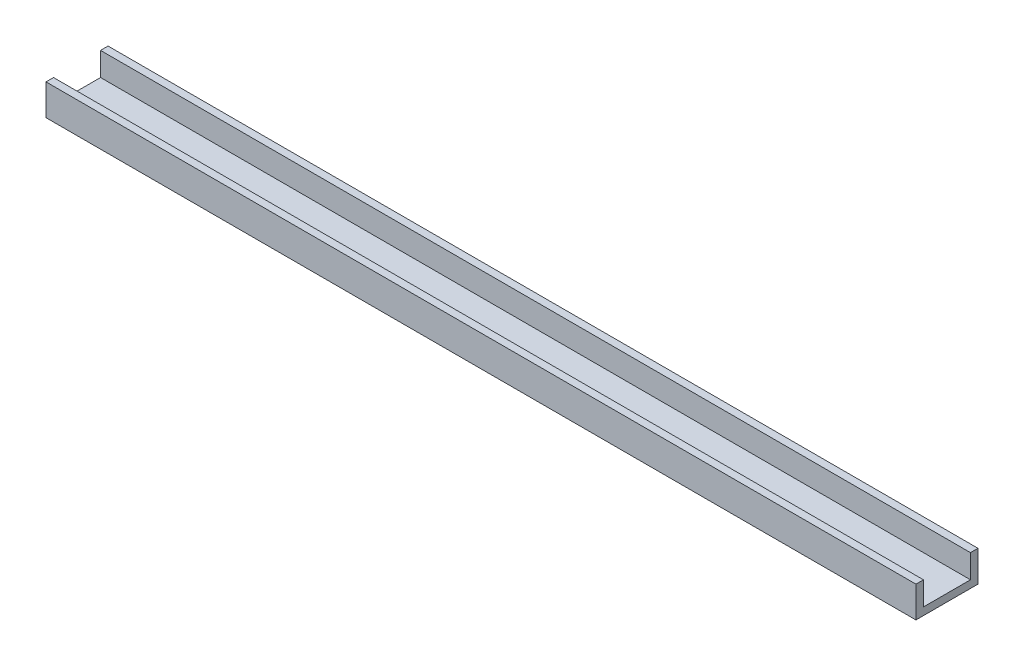
ISO-10303-21;
HEADER;
FILE_DESCRIPTION(('STEP AP214'),'2;1');
FILE_NAME('part.step','',(''),(''),'','','');
FILE_SCHEMA(('AUTOMOTIVE_DESIGN { 1 0 10303 214 1 1 1 1 }'));
ENDSEC;
DATA;
#1=APPLICATION_CONTEXT('core data for automotive mechanical design processes');
#2=APPLICATION_PROTOCOL_DEFINITION('international standard','automotive_design',2000,#1);
#3=PRODUCT_CONTEXT('',#1,'mechanical');
#4=PRODUCT('Part','Part','',(#3));
#5=PRODUCT_RELATED_PRODUCT_CATEGORY('part','',(#4));
#6=PRODUCT_DEFINITION_FORMATION('','',#4);
#7=PRODUCT_DEFINITION_CONTEXT('part definition',#1,'design');
#8=PRODUCT_DEFINITION('design','',#6,#7);
#9=PRODUCT_DEFINITION_SHAPE('','',#8);
#10=(LENGTH_UNIT() NAMED_UNIT(*) SI_UNIT(.MILLI.,.METRE.));
#11=(NAMED_UNIT(*) PLANE_ANGLE_UNIT() SI_UNIT($,.RADIAN.));
#12=(NAMED_UNIT(*) SI_UNIT($,.STERADIAN.) SOLID_ANGLE_UNIT());
#13=UNCERTAINTY_MEASURE_WITH_UNIT(LENGTH_MEASURE(1.E-05),#10,'distance_accuracy_value','');
#14=(GEOMETRIC_REPRESENTATION_CONTEXT(3) GLOBAL_UNCERTAINTY_ASSIGNED_CONTEXT((#13)) GLOBAL_UNIT_ASSIGNED_CONTEXT((#10,
#11,#12)) REPRESENTATION_CONTEXT('',''));
#15=CARTESIAN_POINT('',(0.,0.,0.));
#16=DIRECTION('',(0.,0.,1.));
#17=DIRECTION('',(1.,0.,0.));
#18=AXIS2_PLACEMENT_3D('',#15,#16,#17);
#19=CARTESIAN_POINT('',(1850.,50.,0.));
#20=DIRECTION('',(0.,-1.,0.));
#21=DIRECTION('',(0.,0.,-1.));
#22=AXIS2_PLACEMENT_3D('',#19,#20,#21);
#23=PLANE('',#22);
#24=DIRECTION('',(0.,0.,1.));
#25=VECTOR('',#24,1.);
#26=CARTESIAN_POINT('',(0.,50.,0.));
#27=LINE('',#26,#25);
#28=CARTESIAN_POINT('',(0.,50.,0.));
#29=VERTEX_POINT('',#28);
#30=CARTESIAN_POINT('',(0.,50.,16.));
#31=VERTEX_POINT('',#30);
#32=EDGE_CURVE('E129',#29,#31,#27,.T.);
#33=ORIENTED_EDGE('',*,*,#32,.T.);
#34=DIRECTION('',(-1.,0.,0.));
#35=VECTOR('',#34,1.);
#36=CARTESIAN_POINT('',(1850.,50.,16.));
#37=LINE('',#36,#35);
#38=CARTESIAN_POINT('',(1850.,50.,16.));
#39=VERTEX_POINT('',#38);
#40=EDGE_CURVE('E11',#39,#31,#37,.T.);
#41=ORIENTED_EDGE('',*,*,#40,.F.);
#42=DIRECTION('',(0.,0.,1.));
#43=VECTOR('',#42,1.);
#44=CARTESIAN_POINT('',(1850.,50.,0.));
#45=LINE('',#44,#43);
#46=CARTESIAN_POINT('',(1850.,50.,0.));
#47=VERTEX_POINT('',#46);
#48=EDGE_CURVE('E143',#47,#39,#45,.T.);
#49=ORIENTED_EDGE('',*,*,#48,.F.);
#50=DIRECTION('',(-1.,0.,0.));
#51=VECTOR('',#50,1.);
#52=CARTESIAN_POINT('',(1850.,50.,0.));
#53=LINE('',#52,#51);
#54=EDGE_CURVE('E125',#47,#29,#53,.T.);
#55=ORIENTED_EDGE('',*,*,#54,.T.);
#56=EDGE_LOOP('',(#33,#41,#49,#55));
#57=FACE_BOUND('',#56,.T.);
#58=ADVANCED_FACE('F33',(#57),#23,.F.);
#59=CARTESIAN_POINT('',(1850.,50.,16.));
#60=DIRECTION('',(0.,0.,-1.));
#61=DIRECTION('',(-1.,0.,0.));
#62=AXIS2_PLACEMENT_3D('',#59,#60,#61);
#63=PLANE('',#62);
#64=DIRECTION('',(0.,-1.,0.));
#65=VECTOR('',#64,1.);
#66=CARTESIAN_POINT('',(0.,50.,16.));
#67=LINE('',#66,#65);
#68=CARTESIAN_POINT('',(0.,-16.,16.));
#69=VERTEX_POINT('',#68);
#70=EDGE_CURVE('E132',#31,#69,#67,.T.);
#71=ORIENTED_EDGE('',*,*,#70,.T.);
#72=DIRECTION('',(-1.,0.,0.));
#73=VECTOR('',#72,1.);
#74=CARTESIAN_POINT('',(1850.,-16.,16.));
#75=LINE('',#74,#73);
#76=CARTESIAN_POINT('',(1850.,-16.,16.));
#77=VERTEX_POINT('',#76);
#78=EDGE_CURVE('E41',#77,#69,#75,.T.);
#79=ORIENTED_EDGE('',*,*,#78,.F.);
#80=DIRECTION('',(0.,-1.,0.));
#81=VECTOR('',#80,1.);
#82=CARTESIAN_POINT('',(1850.,50.,16.));
#83=LINE('',#82,#81);
#84=EDGE_CURVE('E92',#39,#77,#83,.T.);
#85=ORIENTED_EDGE('',*,*,#84,.F.);
#86=ORIENTED_EDGE('',*,*,#40,.T.);
#87=EDGE_LOOP('',(#71,#79,#85,#86));
#88=FACE_BOUND('',#87,.T.);
#89=ADVANCED_FACE('F178',(#88),#63,.F.);
#90=CARTESIAN_POINT('',(1850.,-16.,16.));
#91=DIRECTION('',(0.,1.,0.));
#92=DIRECTION('',(0.,0.,1.));
#93=AXIS2_PLACEMENT_3D('',#90,#91,#92);
#94=PLANE('',#93);
#95=DIRECTION('',(0.,0.,-1.));
#96=VECTOR('',#95,1.);
#97=CARTESIAN_POINT('',(0.,-16.,16.));
#98=LINE('',#97,#96);
#99=CARTESIAN_POINT('',(0.,-16.,-116.));
#100=VERTEX_POINT('',#99);
#101=EDGE_CURVE('E134',#69,#100,#98,.T.);
#102=ORIENTED_EDGE('',*,*,#101,.T.);
#103=DIRECTION('',(-1.,0.,0.));
#104=VECTOR('',#103,1.);
#105=CARTESIAN_POINT('',(1850.,-16.,-116.));
#106=LINE('',#105,#104);
#107=CARTESIAN_POINT('',(1850.,-16.,-116.));
#108=VERTEX_POINT('',#107);
#109=EDGE_CURVE('E150',#108,#100,#106,.T.);
#110=ORIENTED_EDGE('',*,*,#109,.F.);
#111=DIRECTION('',(0.,0.,-1.));
#112=VECTOR('',#111,1.);
#113=CARTESIAN_POINT('',(1850.,-16.,16.));
#114=LINE('',#113,#112);
#115=EDGE_CURVE('E158',#77,#108,#114,.T.);
#116=ORIENTED_EDGE('',*,*,#115,.F.);
#117=ORIENTED_EDGE('',*,*,#78,.T.);
#118=EDGE_LOOP('',(#102,#110,#116,#117));
#119=FACE_BOUND('',#118,.T.);
#120=ADVANCED_FACE('F156',(#119),#94,.F.);
#121=CARTESIAN_POINT('',(1850.,-16.,-116.));
#122=DIRECTION('',(0.,0.,1.));
#123=DIRECTION('',(1.,0.,0.));
#124=AXIS2_PLACEMENT_3D('',#121,#122,#123);
#125=PLANE('',#124);
#126=DIRECTION('',(0.,1.,0.));
#127=VECTOR('',#126,1.);
#128=CARTESIAN_POINT('',(0.,-16.,-116.));
#129=LINE('',#128,#127);
#130=CARTESIAN_POINT('',(0.,50.,-116.));
#131=VERTEX_POINT('',#130);
#132=EDGE_CURVE('E136',#100,#131,#129,.T.);
#133=ORIENTED_EDGE('',*,*,#132,.T.);
#134=DIRECTION('',(-1.,0.,0.));
#135=VECTOR('',#134,1.);
#136=CARTESIAN_POINT('',(1850.,50.,-116.));
#137=LINE('',#136,#135);
#138=CARTESIAN_POINT('',(1850.,50.,-116.));
#139=VERTEX_POINT('',#138);
#140=EDGE_CURVE('E147',#139,#131,#137,.T.);
#141=ORIENTED_EDGE('',*,*,#140,.F.);
#142=DIRECTION('',(0.,1.,0.));
#143=VECTOR('',#142,1.);
#144=CARTESIAN_POINT('',(1850.,-16.,-116.));
#145=LINE('',#144,#143);
#146=EDGE_CURVE('E170',#108,#139,#145,.T.);
#147=ORIENTED_EDGE('',*,*,#146,.F.);
#148=ORIENTED_EDGE('',*,*,#109,.T.);
#149=EDGE_LOOP('',(#133,#141,#147,#148));
#150=FACE_BOUND('',#149,.T.);
#151=ADVANCED_FACE('F166',(#150),#125,.F.);
#152=CARTESIAN_POINT('',(1850.,50.,-100.));
#153=DIRECTION('',(0.,-1.,0.));
#154=DIRECTION('',(0.,0.,-1.));
#155=AXIS2_PLACEMENT_3D('',#152,#153,#154);
#156=PLANE('',#155);
#157=DIRECTION('',(0.,0.,1.));
#158=VECTOR('',#157,1.);
#159=CARTESIAN_POINT('',(0.,50.,-100.));
#160=LINE('',#159,#158);
#161=CARTESIAN_POINT('',(0.,50.,-100.));
#162=VERTEX_POINT('',#161);
#163=EDGE_CURVE('E138',#131,#162,#160,.T.);
#164=ORIENTED_EDGE('',*,*,#163,.T.);
#165=DIRECTION('',(-1.,0.,0.));
#166=VECTOR('',#165,1.);
#167=CARTESIAN_POINT('',(1850.,50.,-100.));
#168=LINE('',#167,#166);
#169=CARTESIAN_POINT('',(1850.,50.,-100.));
#170=VERTEX_POINT('',#169);
#171=EDGE_CURVE('E120',#170,#162,#168,.T.);
#172=ORIENTED_EDGE('',*,*,#171,.F.);
#173=DIRECTION('',(0.,0.,1.));
#174=VECTOR('',#173,1.);
#175=CARTESIAN_POINT('',(1850.,50.,-100.));
#176=LINE('',#175,#174);
#177=EDGE_CURVE('E111',#139,#170,#176,.T.);
#178=ORIENTED_EDGE('',*,*,#177,.F.);
#179=ORIENTED_EDGE('',*,*,#140,.T.);
#180=EDGE_LOOP('',(#164,#172,#178,#179));
#181=FACE_BOUND('',#180,.T.);
#182=ADVANCED_FACE('F169',(#181),#156,.F.);
#183=CARTESIAN_POINT('',(1850.,0.,-100.));
#184=DIRECTION('',(0.,0.,-1.));
#185=DIRECTION('',(-1.,0.,0.));
#186=AXIS2_PLACEMENT_3D('',#183,#184,#185);
#187=PLANE('',#186);
#188=DIRECTION('',(0.,-1.,0.));
#189=VECTOR('',#188,1.);
#190=CARTESIAN_POINT('',(0.,0.,-100.));
#191=LINE('',#190,#189);
#192=CARTESIAN_POINT('',(0.,0.,-100.));
#193=VERTEX_POINT('',#192);
#194=EDGE_CURVE('E119',#162,#193,#191,.T.);
#195=ORIENTED_EDGE('',*,*,#194,.T.);
#196=DIRECTION('',(-1.,0.,0.));
#197=VECTOR('',#196,1.);
#198=CARTESIAN_POINT('',(1850.,0.,-100.));
#199=LINE('',#198,#197);
#200=CARTESIAN_POINT('',(1850.,0.,-100.));
#201=VERTEX_POINT('',#200);
#202=EDGE_CURVE('E116',#201,#193,#199,.T.);
#203=ORIENTED_EDGE('',*,*,#202,.F.);
#204=DIRECTION('',(0.,-1.,0.));
#205=VECTOR('',#204,1.);
#206=CARTESIAN_POINT('',(1850.,0.,-100.));
#207=LINE('',#206,#205);
#208=EDGE_CURVE('E105',#170,#201,#207,.T.);
#209=ORIENTED_EDGE('',*,*,#208,.F.);
#210=ORIENTED_EDGE('',*,*,#171,.T.);
#211=EDGE_LOOP('',(#195,#203,#209,#210));
#212=FACE_BOUND('',#211,.T.);
#213=ADVANCED_FACE('F117',(#212),#187,.F.);
#214=CARTESIAN_POINT('',(1850.,0.,0.));
#215=DIRECTION('',(0.,-1.,0.));
#216=DIRECTION('',(0.,0.,-1.));
#217=AXIS2_PLACEMENT_3D('',#214,#215,#216);
#218=PLANE('',#217);
#219=DIRECTION('',(0.,0.,1.));
#220=VECTOR('',#219,1.);
#221=CARTESIAN_POINT('',(0.,0.,0.));
#222=LINE('',#221,#220);
#223=CARTESIAN_POINT('',(0.,0.,0.));
#224=VERTEX_POINT('',#223);
#225=EDGE_CURVE('E78',#193,#224,#222,.T.);
#226=ORIENTED_EDGE('',*,*,#225,.T.);
#227=DIRECTION('',(-1.,0.,0.));
#228=VECTOR('',#227,1.);
#229=CARTESIAN_POINT('',(1850.,0.,0.));
#230=LINE('',#229,#228);
#231=CARTESIAN_POINT('',(1850.,0.,0.));
#232=VERTEX_POINT('',#231);
#233=EDGE_CURVE('E121',#232,#224,#230,.T.);
#234=ORIENTED_EDGE('',*,*,#233,.F.);
#235=DIRECTION('',(0.,0.,1.));
#236=VECTOR('',#235,1.);
#237=CARTESIAN_POINT('',(1850.,0.,0.));
#238=LINE('',#237,#236);
#239=EDGE_CURVE('E109',#201,#232,#238,.T.);
#240=ORIENTED_EDGE('',*,*,#239,.F.);
#241=ORIENTED_EDGE('',*,*,#202,.T.);
#242=EDGE_LOOP('',(#226,#234,#240,#241));
#243=FACE_BOUND('',#242,.T.);
#244=ADVANCED_FACE('F123',(#243),#218,.F.);
#245=CARTESIAN_POINT('',(1850.,50.,0.));
#246=DIRECTION('',(0.,0.,1.));
#247=DIRECTION('',(0.,-1.,0.));
#248=AXIS2_PLACEMENT_3D('',#245,#246,#247);
#249=PLANE('',#248);
#250=DIRECTION('',(0.,1.,0.));
#251=VECTOR('',#250,1.);
#252=CARTESIAN_POINT('',(0.,50.,0.));
#253=LINE('',#252,#251);
#254=EDGE_CURVE('E84',#224,#29,#253,.T.);
#255=ORIENTED_EDGE('',*,*,#254,.T.);
#256=ORIENTED_EDGE('',*,*,#54,.F.);
#257=DIRECTION('',(0.,1.,0.));
#258=VECTOR('',#257,1.);
#259=CARTESIAN_POINT('',(1850.,50.,0.));
#260=LINE('',#259,#258);
#261=EDGE_CURVE('E49',#232,#47,#260,.T.);
#262=ORIENTED_EDGE('',*,*,#261,.F.);
#263=ORIENTED_EDGE('',*,*,#233,.T.);
#264=EDGE_LOOP('',(#255,#256,#262,#263));
#265=FACE_BOUND('',#264,.T.);
#266=ADVANCED_FACE('F194',(#265),#249,.F.);
#267=CARTESIAN_POINT('',(1850.,0.,0.));
#268=DIRECTION('',(1.,0.,0.));
#269=DIRECTION('',(0.,0.,-1.));
#270=AXIS2_PLACEMENT_3D('',#267,#268,#269);
#271=PLANE('',#270);
#272=ORIENTED_EDGE('',*,*,#48,.T.);
#273=ORIENTED_EDGE('',*,*,#84,.T.);
#274=ORIENTED_EDGE('',*,*,#115,.T.);
#275=ORIENTED_EDGE('',*,*,#146,.T.);
#276=ORIENTED_EDGE('',*,*,#177,.T.);
#277=ORIENTED_EDGE('',*,*,#208,.T.);
#278=ORIENTED_EDGE('',*,*,#239,.T.);
#279=ORIENTED_EDGE('',*,*,#261,.T.);
#280=EDGE_LOOP('',(#272,#273,#274,#275,#276,#277,#278,#279));
#281=FACE_BOUND('',#280,.T.);
#282=ADVANCED_FACE('F107',(#281),#271,.T.);
#283=CARTESIAN_POINT('',(0.,0.,0.));
#284=DIRECTION('',(1.,0.,0.));
#285=DIRECTION('',(0.,0.,-1.));
#286=AXIS2_PLACEMENT_3D('',#283,#284,#285);
#287=PLANE('',#286);
#288=ORIENTED_EDGE('',*,*,#32,.F.);
#289=ORIENTED_EDGE('',*,*,#254,.F.);
#290=ORIENTED_EDGE('',*,*,#225,.F.);
#291=ORIENTED_EDGE('',*,*,#194,.F.);
#292=ORIENTED_EDGE('',*,*,#163,.F.);
#293=ORIENTED_EDGE('',*,*,#132,.F.);
#294=ORIENTED_EDGE('',*,*,#101,.F.);
#295=ORIENTED_EDGE('',*,*,#70,.F.);
#296=EDGE_LOOP('',(#288,#289,#290,#291,#292,#293,#294,#295));
#297=FACE_BOUND('',#296,.T.);
#298=ADVANCED_FACE('F162',(#297),#287,.F.);
#299=CLOSED_SHELL('',(#58,#89,#120,#151,#182,#213,#244,#266,#282,#298));
#300=MANIFOLD_SOLID_BREP('B2',#299);
#301=ADVANCED_BREP_SHAPE_REPRESENTATION('',(#18,#300),#14);
#302=SHAPE_DEFINITION_REPRESENTATION(#9,#301);
ENDSEC;
END-ISO-10303-21;
